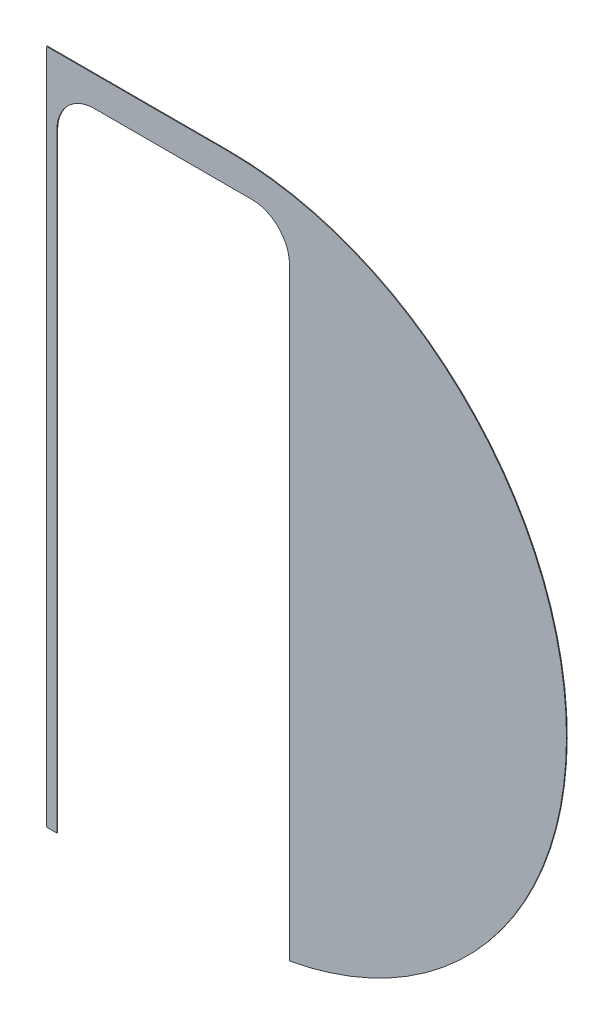
ISO-10303-21;
HEADER;
FILE_DESCRIPTION(('STEP AP214'),'2;1');
FILE_NAME('part.step','',(''),(''),'','','');
FILE_SCHEMA(('AUTOMOTIVE_DESIGN { 1 0 10303 214 1 1 1 1 }'));
ENDSEC;
DATA;
#1=APPLICATION_CONTEXT('core data for automotive mechanical design processes');
#2=APPLICATION_PROTOCOL_DEFINITION('international standard','automotive_design',2000,#1);
#3=PRODUCT_CONTEXT('',#1,'mechanical');
#4=PRODUCT('Part','Part','',(#3));
#5=PRODUCT_RELATED_PRODUCT_CATEGORY('part','',(#4));
#6=PRODUCT_DEFINITION_FORMATION('','',#4);
#7=PRODUCT_DEFINITION_CONTEXT('part definition',#1,'design');
#8=PRODUCT_DEFINITION('design','',#6,#7);
#9=PRODUCT_DEFINITION_SHAPE('','',#8);
#10=(LENGTH_UNIT() NAMED_UNIT(*) SI_UNIT(.MILLI.,.METRE.));
#11=(NAMED_UNIT(*) PLANE_ANGLE_UNIT() SI_UNIT($,.RADIAN.));
#12=(NAMED_UNIT(*) SI_UNIT($,.STERADIAN.) SOLID_ANGLE_UNIT());
#13=UNCERTAINTY_MEASURE_WITH_UNIT(LENGTH_MEASURE(1.E-05),#10,'distance_accuracy_value','');
#14=(GEOMETRIC_REPRESENTATION_CONTEXT(3) GLOBAL_UNCERTAINTY_ASSIGNED_CONTEXT((#13)) GLOBAL_UNIT_ASSIGNED_CONTEXT((#10,
#11,#12)) REPRESENTATION_CONTEXT('',''));
#15=CARTESIAN_POINT('',(0.,0.,0.));
#16=DIRECTION('',(0.,0.,1.));
#17=DIRECTION('',(1.,0.,0.));
#18=AXIS2_PLACEMENT_3D('',#15,#16,#17);
#19=CARTESIAN_POINT('',(0.,0.,2.));
#20=DIRECTION('',(1.,0.,0.));
#21=DIRECTION('',(0.,1.,0.));
#22=AXIS2_PLACEMENT_3D('',#19,#20,#21);
#23=PLANE('',#22);
#24=DIRECTION('',(0.,-1.,0.));
#25=VECTOR('',#24,1.);
#26=CARTESIAN_POINT('',(0.,0.,0.));
#27=LINE('',#26,#25);
#28=CARTESIAN_POINT('',(-3.31573120869146E-13,1805.,0.));
#29=VERTEX_POINT('',#28);
#30=CARTESIAN_POINT('',(0.,0.,0.));
#31=VERTEX_POINT('',#30);
#32=EDGE_CURVE('E161',#29,#31,#27,.T.);
#33=ORIENTED_EDGE('',*,*,#32,.T.);
#34=DIRECTION('',(0.,0.,-1.));
#35=VECTOR('',#34,1.);
#36=CARTESIAN_POINT('',(0.,0.,2.));
#37=LINE('',#36,#35);
#38=CARTESIAN_POINT('',(0.,0.,2.));
#39=VERTEX_POINT('',#38);
#40=EDGE_CURVE('E40',#39,#31,#37,.T.);
#41=ORIENTED_EDGE('',*,*,#40,.F.);
#42=DIRECTION('',(0.,-1.,0.));
#43=VECTOR('',#42,1.);
#44=CARTESIAN_POINT('',(0.,0.,2.));
#45=LINE('',#44,#43);
#46=CARTESIAN_POINT('',(-3.31573120869146E-13,1805.,2.));
#47=VERTEX_POINT('',#46);
#48=EDGE_CURVE('E162',#47,#39,#45,.T.);
#49=ORIENTED_EDGE('',*,*,#48,.F.);
#50=DIRECTION('',(0.,0.,-1.));
#51=VECTOR('',#50,1.);
#52=CARTESIAN_POINT('',(-3.31573120869146E-13,1805.,2.));
#53=LINE('',#52,#51);
#54=EDGE_CURVE('E168',#47,#29,#53,.T.);
#55=ORIENTED_EDGE('',*,*,#54,.T.);
#56=EDGE_LOOP('',(#33,#41,#49,#55));
#57=FACE_BOUND('',#56,.T.);
#58=ADVANCED_FACE('F33',(#57),#23,.F.);
#59=CARTESIAN_POINT('',(0.,0.,2.));
#60=DIRECTION('',(0.,1.,0.));
#61=DIRECTION('',(0.,0.,1.));
#62=AXIS2_PLACEMENT_3D('',#59,#60,#61);
#63=PLANE('',#62);
#64=DIRECTION('',(1.,0.,0.));
#65=VECTOR('',#64,1.);
#66=CARTESIAN_POINT('',(0.,0.,0.));
#67=LINE('',#66,#65);
#68=CARTESIAN_POINT('',(26.9999999999999,0.,0.));
#69=VERTEX_POINT('',#68);
#70=EDGE_CURVE('E171',#31,#69,#67,.T.);
#71=ORIENTED_EDGE('',*,*,#70,.T.);
#72=DIRECTION('',(0.,0.,1.));
#73=VECTOR('',#72,1.);
#74=CARTESIAN_POINT('',(26.9999999999997,0.,2.));
#75=LINE('',#74,#73);
#76=CARTESIAN_POINT('',(26.9999999999997,0.,2.));
#77=VERTEX_POINT('',#76);
#78=EDGE_CURVE('E46',#69,#77,#75,.T.);
#79=ORIENTED_EDGE('',*,*,#78,.T.);
#80=DIRECTION('',(1.,0.,0.));
#81=VECTOR('',#80,1.);
#82=CARTESIAN_POINT('',(0.,0.,2.));
#83=LINE('',#82,#81);
#84=EDGE_CURVE('E78',#39,#77,#83,.T.);
#85=ORIENTED_EDGE('',*,*,#84,.F.);
#86=ORIENTED_EDGE('',*,*,#40,.T.);
#87=EDGE_LOOP('',(#71,#79,#85,#86));
#88=FACE_BOUND('',#87,.T.);
#89=ADVANCED_FACE('F179',(#88),#63,.F.);
#90=CARTESIAN_POINT('',(485.,902.5,2.));
#91=DIRECTION('',(0.,0.,-1.));
#92=DIRECTION('',(-1.,0.,0.));
#93=AXIS2_PLACEMENT_3D('',#90,#91,#92);
#94=CYLINDRICAL_SURFACE('',#93,902.5);
#95=CARTESIAN_POINT('',(485.,902.5,2.));
#96=DIRECTION('',(0.,0.,1.));
#97=DIRECTION('',(-1.,0.,0.));
#98=AXIS2_PLACEMENT_3D('',#95,#96,#97);
#99=CIRCLE('',#98,902.5);
#100=CARTESIAN_POINT('',(647.999999999998,14.8417042577698,2.));
#101=VERTEX_POINT('',#100);
#102=CARTESIAN_POINT('',(485.,1805.,2.));
#103=VERTEX_POINT('',#102);
#104=EDGE_CURVE('E165',#101,#103,#99,.T.);
#105=ORIENTED_EDGE('',*,*,#104,.F.);
#106=DIRECTION('',(0.,0.,-1.));
#107=VECTOR('',#106,1.);
#108=CARTESIAN_POINT('',(647.999999999998,14.8417042577698,2.));
#109=LINE('',#108,#107);
#110=CARTESIAN_POINT('',(647.999999999998,14.8417042577697,2.22044604925031E-13));
#111=VERTEX_POINT('',#110);
#112=EDGE_CURVE('E158',#101,#111,#109,.T.);
#113=ORIENTED_EDGE('',*,*,#112,.T.);
#114=CARTESIAN_POINT('',(485.,902.5,0.));
#115=DIRECTION('',(0.,0.,1.));
#116=DIRECTION('',(-1.,0.,0.));
#117=AXIS2_PLACEMENT_3D('',#114,#115,#116);
#118=CIRCLE('',#117,902.5);
#119=CARTESIAN_POINT('',(485.,1805.,0.));
#120=VERTEX_POINT('',#119);
#121=EDGE_CURVE('E173',#111,#120,#118,.T.);
#122=ORIENTED_EDGE('',*,*,#121,.T.);
#123=DIRECTION('',(0.,0.,-1.));
#124=VECTOR('',#123,1.);
#125=CARTESIAN_POINT('',(485.,1805.,2.));
#126=LINE('',#125,#124);
#127=EDGE_CURVE('E177',#103,#120,#126,.T.);
#128=ORIENTED_EDGE('',*,*,#127,.F.);
#129=EDGE_LOOP('',(#105,#113,#122,#128));
#130=FACE_BOUND('',#129,.T.);
#131=ADVANCED_FACE('F187',(#130),#94,.T.);
#132=CARTESIAN_POINT('',(-3.31573120869146E-13,1805.,2.));
#133=DIRECTION('',(0.,-1.,0.));
#134=DIRECTION('',(1.,0.,0.));
#135=AXIS2_PLACEMENT_3D('',#132,#133,#134);
#136=PLANE('',#135);
#137=DIRECTION('',(-1.,0.,0.));
#138=VECTOR('',#137,1.);
#139=CARTESIAN_POINT('',(-3.31573120869146E-13,1805.,0.));
#140=LINE('',#139,#138);
#141=EDGE_CURVE('E72',#120,#29,#140,.T.);
#142=ORIENTED_EDGE('',*,*,#141,.T.);
#143=ORIENTED_EDGE('',*,*,#54,.F.);
#144=DIRECTION('',(-1.,0.,0.));
#145=VECTOR('',#144,1.);
#146=CARTESIAN_POINT('',(-3.31573120869146E-13,1805.,2.));
#147=LINE('',#146,#145);
#148=EDGE_CURVE('E55',#103,#47,#147,.T.);
#149=ORIENTED_EDGE('',*,*,#148,.F.);
#150=ORIENTED_EDGE('',*,*,#127,.T.);
#151=EDGE_LOOP('',(#142,#143,#149,#150));
#152=FACE_BOUND('',#151,.T.);
#153=ADVANCED_FACE('F188',(#152),#136,.F.);
#154=CARTESIAN_POINT('',(485.,902.5,2.));
#155=DIRECTION('',(0.,0.,-1.));
#156=DIRECTION('',(-1.,0.,0.));
#157=AXIS2_PLACEMENT_3D('',#154,#155,#156);
#158=PLANE('',#157);
#159=CARTESIAN_POINT('',(547.999999999999,1625.,2.));
#160=DIRECTION('',(0.,0.,-1.));
#161=DIRECTION('',(-1.,0.,0.));
#162=AXIS2_PLACEMENT_3D('',#159,#160,#161);
#163=CIRCLE('',#162,100.);
#164=CARTESIAN_POINT('',(547.999999999999,1725.,2.));
#165=VERTEX_POINT('',#164);
#166=CARTESIAN_POINT('',(647.999999999999,1625.,2.));
#167=VERTEX_POINT('',#166);
#168=EDGE_CURVE('E152',#165,#167,#163,.T.);
#169=ORIENTED_EDGE('',*,*,#168,.T.);
#170=DIRECTION('',(0.,-1.,0.));
#171=VECTOR('',#170,1.);
#172=CARTESIAN_POINT('',(647.999999999999,902.5,2.));
#173=LINE('',#172,#171);
#174=EDGE_CURVE('E155',#167,#101,#173,.T.);
#175=ORIENTED_EDGE('',*,*,#174,.T.);
#176=ORIENTED_EDGE('',*,*,#104,.T.);
#177=ORIENTED_EDGE('',*,*,#148,.T.);
#178=ORIENTED_EDGE('',*,*,#48,.T.);
#179=ORIENTED_EDGE('',*,*,#84,.T.);
#180=DIRECTION('',(0.,1.,0.));
#181=VECTOR('',#180,1.);
#182=CARTESIAN_POINT('',(26.9999999999999,902.5,2.));
#183=LINE('',#182,#181);
#184=CARTESIAN_POINT('',(27.,1625.,2.));
#185=VERTEX_POINT('',#184);
#186=EDGE_CURVE('E142',#77,#185,#183,.T.);
#187=ORIENTED_EDGE('',*,*,#186,.T.);
#188=CARTESIAN_POINT('',(127.,1625.,2.));
#189=DIRECTION('',(0.,0.,-1.));
#190=DIRECTION('',(-1.,0.,0.));
#191=AXIS2_PLACEMENT_3D('',#188,#189,#190);
#192=CIRCLE('',#191,100.);
#193=CARTESIAN_POINT('',(127.,1725.,2.));
#194=VERTEX_POINT('',#193);
#195=EDGE_CURVE('E120',#185,#194,#192,.T.);
#196=ORIENTED_EDGE('',*,*,#195,.T.);
#197=DIRECTION('',(1.,0.,0.));
#198=VECTOR('',#197,1.);
#199=CARTESIAN_POINT('',(485.,1725.,2.));
#200=LINE('',#199,#198);
#201=EDGE_CURVE('E149',#194,#165,#200,.T.);
#202=ORIENTED_EDGE('',*,*,#201,.T.);
#203=EDGE_LOOP('',(#169,#175,#176,#177,#178,#179,#187,#196,#202));
#204=FACE_BOUND('',#203,.T.);
#205=ADVANCED_FACE('F189',(#204),#158,.F.);
#206=CARTESIAN_POINT('',(485.,902.5,0.));
#207=DIRECTION('',(0.,0.,-1.));
#208=DIRECTION('',(-1.,0.,0.));
#209=AXIS2_PLACEMENT_3D('',#206,#207,#208);
#210=PLANE('',#209);
#211=DIRECTION('',(0.,-1.,0.));
#212=VECTOR('',#211,1.);
#213=CARTESIAN_POINT('',(647.999999999998,-25.0000000000032,2.22044604925031E-13));
#214=LINE('',#213,#212);
#215=CARTESIAN_POINT('',(647.999999999999,1625.,2.22044604925031E-13));
#216=VERTEX_POINT('',#215);
#217=EDGE_CURVE('E123',#216,#111,#214,.T.);
#218=ORIENTED_EDGE('',*,*,#217,.F.);
#219=CARTESIAN_POINT('',(547.999999999999,1625.,2.22044604925031E-13));
#220=DIRECTION('',(0.,0.,-1.));
#221=DIRECTION('',(1.,0.,0.));
#222=AXIS2_PLACEMENT_3D('',#219,#220,#221);
#223=CIRCLE('',#222,100.);
#224=CARTESIAN_POINT('',(547.999999999999,1725.,2.22044604925031E-13));
#225=VERTEX_POINT('',#224);
#226=EDGE_CURVE('E134',#225,#216,#223,.T.);
#227=ORIENTED_EDGE('',*,*,#226,.F.);
#228=DIRECTION('',(1.,0.,0.));
#229=VECTOR('',#228,1.);
#230=CARTESIAN_POINT('',(547.999999999999,1725.,2.22044604925031E-13));
#231=LINE('',#230,#229);
#232=CARTESIAN_POINT('',(127.,1725.,2.22044604925031E-13));
#233=VERTEX_POINT('',#232);
#234=EDGE_CURVE('E132',#233,#225,#231,.T.);
#235=ORIENTED_EDGE('',*,*,#234,.F.);
#236=CARTESIAN_POINT('',(127.,1625.,2.22044604925031E-13));
#237=DIRECTION('',(0.,0.,-1.));
#238=DIRECTION('',(1.,0.,0.));
#239=AXIS2_PLACEMENT_3D('',#236,#237,#238);
#240=CIRCLE('',#239,100.);
#241=CARTESIAN_POINT('',(27.,1625.,2.22044604925031E-13));
#242=VERTEX_POINT('',#241);
#243=EDGE_CURVE('E117',#242,#233,#240,.T.);
#244=ORIENTED_EDGE('',*,*,#243,.F.);
#245=DIRECTION('',(0.,1.,0.));
#246=VECTOR('',#245,1.);
#247=CARTESIAN_POINT('',(26.9999999999999,902.5,0.));
#248=LINE('',#247,#246);
#249=EDGE_CURVE('E11',#69,#242,#248,.T.);
#250=ORIENTED_EDGE('',*,*,#249,.F.);
#251=ORIENTED_EDGE('',*,*,#70,.F.);
#252=ORIENTED_EDGE('',*,*,#32,.F.);
#253=ORIENTED_EDGE('',*,*,#141,.F.);
#254=ORIENTED_EDGE('',*,*,#121,.F.);
#255=EDGE_LOOP('',(#218,#227,#235,#244,#250,#251,#252,#253,#254));
#256=FACE_BOUND('',#255,.T.);
#257=ADVANCED_FACE('F129',(#256),#210,.T.);
#258=CARTESIAN_POINT('',(647.999999999998,-25.0000000000032,330.));
#259=DIRECTION('',(1.,0.,0.));
#260=DIRECTION('',(0.,1.,0.));
#261=AXIS2_PLACEMENT_3D('',#258,#259,#260);
#262=PLANE('',#261);
#263=ORIENTED_EDGE('',*,*,#174,.F.);
#264=DIRECTION('',(0.,0.,-1.));
#265=VECTOR('',#264,1.);
#266=CARTESIAN_POINT('',(647.999999999999,1625.,330.));
#267=LINE('',#266,#265);
#268=EDGE_CURVE('E140',#167,#216,#267,.T.);
#269=ORIENTED_EDGE('',*,*,#268,.T.);
#270=ORIENTED_EDGE('',*,*,#217,.T.);
#271=ORIENTED_EDGE('',*,*,#112,.F.);
#272=EDGE_LOOP('',(#263,#269,#270,#271));
#273=FACE_BOUND('',#272,.T.);
#274=ADVANCED_FACE('F197',(#273),#262,.F.);
#275=CARTESIAN_POINT('',(547.999999999999,1625.,330.));
#276=DIRECTION('',(0.,0.,-1.));
#277=DIRECTION('',(-1.,0.,0.));
#278=AXIS2_PLACEMENT_3D('',#275,#276,#277);
#279=CYLINDRICAL_SURFACE('',#278,100.);
#280=DIRECTION('',(0.,0.,-1.));
#281=VECTOR('',#280,1.);
#282=CARTESIAN_POINT('',(547.999999999999,1725.,330.));
#283=LINE('',#282,#281);
#284=EDGE_CURVE('E143',#165,#225,#283,.T.);
#285=ORIENTED_EDGE('',*,*,#284,.T.);
#286=ORIENTED_EDGE('',*,*,#226,.T.);
#287=ORIENTED_EDGE('',*,*,#268,.F.);
#288=ORIENTED_EDGE('',*,*,#168,.F.);
#289=EDGE_LOOP('',(#285,#286,#287,#288));
#290=FACE_BOUND('',#289,.T.);
#291=ADVANCED_FACE('F194',(#290),#279,.F.);
#292=CARTESIAN_POINT('',(547.999999999999,1725.,330.));
#293=DIRECTION('',(0.,1.,0.));
#294=DIRECTION('',(0.,0.,1.));
#295=AXIS2_PLACEMENT_3D('',#292,#293,#294);
#296=PLANE('',#295);
#297=DIRECTION('',(0.,0.,-1.));
#298=VECTOR('',#297,1.);
#299=CARTESIAN_POINT('',(127.,1725.,330.));
#300=LINE('',#299,#298);
#301=EDGE_CURVE('E122',#194,#233,#300,.T.);
#302=ORIENTED_EDGE('',*,*,#301,.T.);
#303=ORIENTED_EDGE('',*,*,#234,.T.);
#304=ORIENTED_EDGE('',*,*,#284,.F.);
#305=ORIENTED_EDGE('',*,*,#201,.F.);
#306=EDGE_LOOP('',(#302,#303,#304,#305));
#307=FACE_BOUND('',#306,.T.);
#308=ADVANCED_FACE('F192',(#307),#296,.F.);
#309=CARTESIAN_POINT('',(127.,1625.,330.));
#310=DIRECTION('',(0.,0.,-1.));
#311=DIRECTION('',(-1.,0.,0.));
#312=AXIS2_PLACEMENT_3D('',#309,#310,#311);
#313=CYLINDRICAL_SURFACE('',#312,100.);
#314=DIRECTION('',(0.,0.,-1.));
#315=VECTOR('',#314,1.);
#316=CARTESIAN_POINT('',(27.,1625.,330.));
#317=LINE('',#316,#315);
#318=EDGE_CURVE('E113',#185,#242,#317,.T.);
#319=ORIENTED_EDGE('',*,*,#318,.T.);
#320=ORIENTED_EDGE('',*,*,#243,.T.);
#321=ORIENTED_EDGE('',*,*,#301,.F.);
#322=ORIENTED_EDGE('',*,*,#195,.F.);
#323=EDGE_LOOP('',(#319,#320,#321,#322));
#324=FACE_BOUND('',#323,.T.);
#325=ADVANCED_FACE('F114',(#324),#313,.F.);
#326=CARTESIAN_POINT('',(26.9999999999997,-25.0000000000032,330.));
#327=DIRECTION('',(-1.,0.,0.));
#328=DIRECTION('',(0.,-1.,0.));
#329=AXIS2_PLACEMENT_3D('',#326,#327,#328);
#330=PLANE('',#329);
#331=ORIENTED_EDGE('',*,*,#249,.T.);
#332=ORIENTED_EDGE('',*,*,#318,.F.);
#333=ORIENTED_EDGE('',*,*,#186,.F.);
#334=ORIENTED_EDGE('',*,*,#78,.F.);
#335=EDGE_LOOP('',(#331,#332,#333,#334));
#336=FACE_BOUND('',#335,.T.);
#337=ADVANCED_FACE('F125',(#336),#330,.F.);
#338=CLOSED_SHELL('',(#58,#89,#131,#153,#205,#257,#274,#291,#308,#325,#337));
#339=MANIFOLD_SOLID_BREP('B2',#338);
#340=ADVANCED_BREP_SHAPE_REPRESENTATION('',(#18,#339),#14);
#341=SHAPE_DEFINITION_REPRESENTATION(#9,#340);
ENDSEC;
END-ISO-10303-21;
